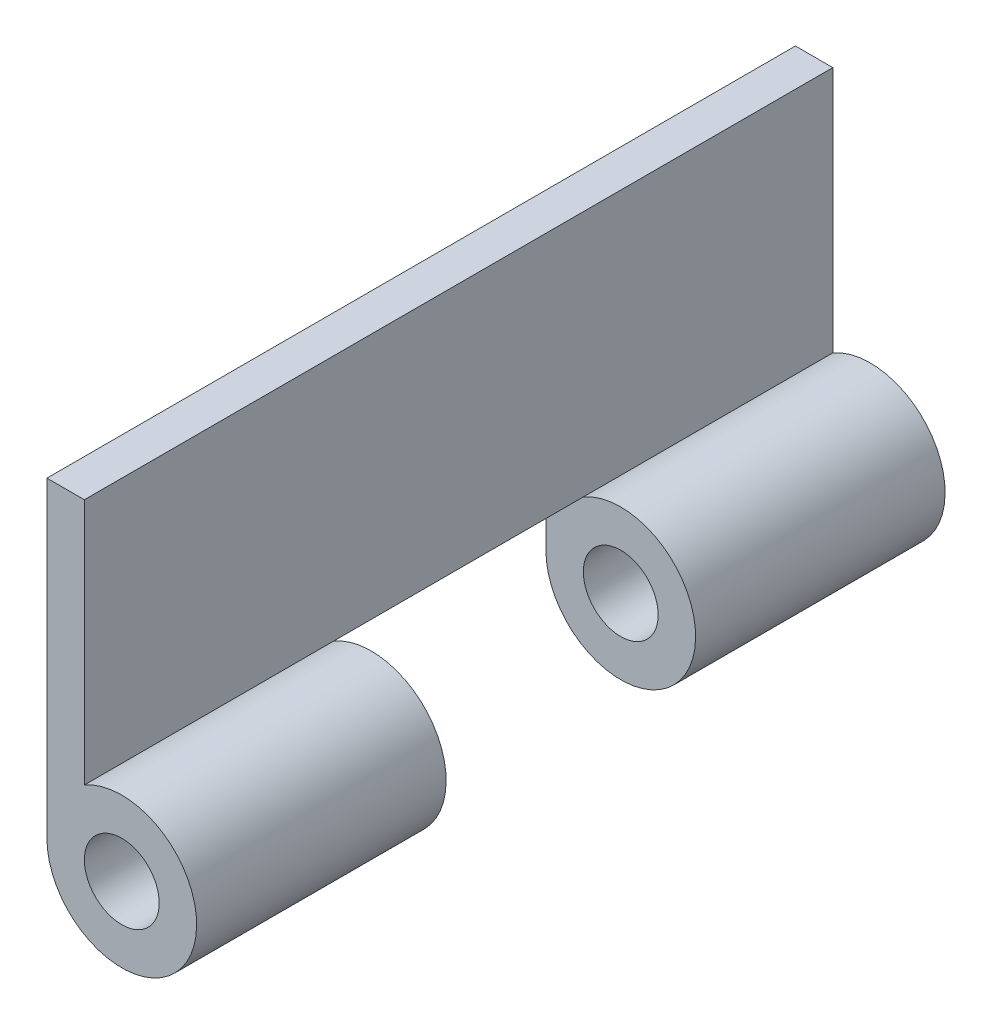
ISO-10303-21;
HEADER;
FILE_DESCRIPTION(('STEP AP214'),'2;1');
FILE_NAME('part.step','',(''),(''),'','','');
FILE_SCHEMA(('AUTOMOTIVE_DESIGN { 1 0 10303 214 1 1 1 1 }'));
ENDSEC;
DATA;
#1=APPLICATION_CONTEXT('core data for automotive mechanical design processes');
#2=APPLICATION_PROTOCOL_DEFINITION('international standard','automotive_design',2000,#1);
#3=PRODUCT_CONTEXT('',#1,'mechanical');
#4=PRODUCT('Part','Part','',(#3));
#5=PRODUCT_RELATED_PRODUCT_CATEGORY('part','',(#4));
#6=PRODUCT_DEFINITION_FORMATION('','',#4);
#7=PRODUCT_DEFINITION_CONTEXT('part definition',#1,'design');
#8=PRODUCT_DEFINITION('design','',#6,#7);
#9=PRODUCT_DEFINITION_SHAPE('','',#8);
#10=(LENGTH_UNIT() NAMED_UNIT(*) SI_UNIT(.MILLI.,.METRE.));
#11=(NAMED_UNIT(*) PLANE_ANGLE_UNIT() SI_UNIT($,.RADIAN.));
#12=(NAMED_UNIT(*) SI_UNIT($,.STERADIAN.) SOLID_ANGLE_UNIT());
#13=UNCERTAINTY_MEASURE_WITH_UNIT(LENGTH_MEASURE(1.E-05),#10,'distance_accuracy_value','');
#14=(GEOMETRIC_REPRESENTATION_CONTEXT(3) GLOBAL_UNCERTAINTY_ASSIGNED_CONTEXT((#13)) GLOBAL_UNIT_ASSIGNED_CONTEXT((#10,
#11,#12)) REPRESENTATION_CONTEXT('',''));
#15=CARTESIAN_POINT('',(0.,0.,0.));
#16=DIRECTION('',(0.,0.,1.));
#17=DIRECTION('',(1.,0.,0.));
#18=AXIS2_PLACEMENT_3D('',#15,#16,#17);
#19=CARTESIAN_POINT('',(0.,0.,60.));
#20=DIRECTION('',(0.,0.,-1.));
#21=DIRECTION('',(-1.,0.,0.));
#22=AXIS2_PLACEMENT_3D('',#19,#20,#21);
#23=CYLINDRICAL_SURFACE('',#22,6.);
#24=CARTESIAN_POINT('',(0.,0.,20.));
#25=DIRECTION('',(0.,0.,1.));
#26=DIRECTION('',(1.,0.,0.));
#27=AXIS2_PLACEMENT_3D('',#24,#25,#26);
#28=CIRCLE('',#27,6.);
#29=CARTESIAN_POINT('',(-6.,0.,20.));
#30=VERTEX_POINT('',#29);
#31=CARTESIAN_POINT('',(-3.,5.19615242270663,20.));
#32=VERTEX_POINT('',#31);
#33=EDGE_CURVE('E159',#30,#32,#28,.T.);
#34=ORIENTED_EDGE('',*,*,#33,.F.);
#35=DIRECTION('',(0.,0.,-1.));
#36=VECTOR('',#35,1.);
#37=CARTESIAN_POINT('',(-6.,0.,60.));
#38=LINE('',#37,#36);
#39=CARTESIAN_POINT('',(-6.,0.,0.));
#40=VERTEX_POINT('',#39);
#41=EDGE_CURVE('E88',#30,#40,#38,.T.);
#42=ORIENTED_EDGE('',*,*,#41,.T.);
#43=CARTESIAN_POINT('',(0.,0.,0.));
#44=DIRECTION('',(0.,0.,1.));
#45=DIRECTION('',(1.,0.,0.));
#46=AXIS2_PLACEMENT_3D('',#43,#44,#45);
#47=CIRCLE('',#46,6.);
#48=CARTESIAN_POINT('',(-3.,5.19615242270663,0.));
#49=VERTEX_POINT('',#48);
#50=EDGE_CURVE('E200',#40,#49,#47,.T.);
#51=ORIENTED_EDGE('',*,*,#50,.T.);
#52=DIRECTION('',(0.,0.,-1.));
#53=VECTOR('',#52,1.);
#54=CARTESIAN_POINT('',(-3.,5.19615242270663,60.));
#55=LINE('',#54,#53);
#56=EDGE_CURVE('E49',#32,#49,#55,.T.);
#57=ORIENTED_EDGE('',*,*,#56,.F.);
#58=EDGE_LOOP('',(#34,#42,#51,#57));
#59=FACE_BOUND('',#58,.T.);
#60=ADVANCED_FACE('F39',(#59),#23,.T.);
#61=CARTESIAN_POINT('',(0.,0.,60.));
#62=DIRECTION('',(0.,0.,-1.));
#63=DIRECTION('',(-1.,0.,0.));
#64=AXIS2_PLACEMENT_3D('',#61,#62,#63);
#65=CYLINDRICAL_SURFACE('',#64,3.);
#66=CARTESIAN_POINT('',(0.,0.,0.));
#67=DIRECTION('',(0.,0.,1.));
#68=DIRECTION('',(1.,0.,0.));
#69=AXIS2_PLACEMENT_3D('',#66,#67,#68);
#70=CIRCLE('',#69,3.);
#71=CARTESIAN_POINT('',(3.,0.,0.));
#72=VERTEX_POINT('',#71);
#73=EDGE_CURVE('E189',#72,#72,#70,.T.);
#74=ORIENTED_EDGE('',*,*,#73,.F.);
#75=EDGE_LOOP('',(#74));
#76=FACE_BOUND('',#75,.T.);
#77=CARTESIAN_POINT('',(0.,0.,20.));
#78=DIRECTION('',(0.,0.,1.));
#79=DIRECTION('',(1.,0.,0.));
#80=AXIS2_PLACEMENT_3D('',#77,#78,#79);
#81=CIRCLE('',#80,3.);
#82=CARTESIAN_POINT('',(3.,0.,20.));
#83=VERTEX_POINT('',#82);
#84=EDGE_CURVE('E125',#83,#83,#81,.T.);
#85=ORIENTED_EDGE('',*,*,#84,.T.);
#86=EDGE_LOOP('',(#85));
#87=FACE_BOUND('',#86,.T.);
#88=ADVANCED_FACE('F150',(#76,#87),#65,.F.);
#89=CARTESIAN_POINT('',(0.,0.,60.));
#90=DIRECTION('',(0.,0.,1.));
#91=DIRECTION('',(1.,0.,0.));
#92=AXIS2_PLACEMENT_3D('',#89,#90,#91);
#93=PLANE('',#92);
#94=CARTESIAN_POINT('',(0.,0.,60.));
#95=DIRECTION('',(0.,0.,1.));
#96=DIRECTION('',(1.,0.,0.));
#97=AXIS2_PLACEMENT_3D('',#94,#95,#96);
#98=CIRCLE('',#97,6.);
#99=CARTESIAN_POINT('',(-6.,0.,60.));
#100=VERTEX_POINT('',#99);
#101=CARTESIAN_POINT('',(-3.,5.19615242270663,60.));
#102=VERTEX_POINT('',#101);
#103=EDGE_CURVE('E203',#100,#102,#98,.T.);
#104=ORIENTED_EDGE('',*,*,#103,.T.);
#105=DIRECTION('',(0.,1.,0.));
#106=VECTOR('',#105,1.);
#107=CARTESIAN_POINT('',(-3.,25.,60.));
#108=LINE('',#107,#106);
#109=CARTESIAN_POINT('',(-3.,25.,60.));
#110=VERTEX_POINT('',#109);
#111=EDGE_CURVE('E95',#102,#110,#108,.T.);
#112=ORIENTED_EDGE('',*,*,#111,.T.);
#113=DIRECTION('',(-1.,0.,0.));
#114=VECTOR('',#113,1.);
#115=CARTESIAN_POINT('',(-6.,25.,60.));
#116=LINE('',#115,#114);
#117=CARTESIAN_POINT('',(-6.,25.,60.));
#118=VERTEX_POINT('',#117);
#119=EDGE_CURVE('E174',#110,#118,#116,.T.);
#120=ORIENTED_EDGE('',*,*,#119,.T.);
#121=DIRECTION('',(0.,-1.,0.));
#122=VECTOR('',#121,1.);
#123=CARTESIAN_POINT('',(-6.,0.,60.));
#124=LINE('',#123,#122);
#125=EDGE_CURVE('E66',#118,#100,#124,.T.);
#126=ORIENTED_EDGE('',*,*,#125,.T.);
#127=EDGE_LOOP('',(#104,#112,#120,#126));
#128=FACE_BOUND('',#127,.T.);
#129=CARTESIAN_POINT('',(0.,0.,60.));
#130=DIRECTION('',(0.,0.,1.));
#131=DIRECTION('',(1.,0.,0.));
#132=AXIS2_PLACEMENT_3D('',#129,#130,#131);
#133=CIRCLE('',#132,3.);
#134=CARTESIAN_POINT('',(3.,0.,60.));
#135=VERTEX_POINT('',#134);
#136=EDGE_CURVE('E194',#135,#135,#133,.T.);
#137=ORIENTED_EDGE('',*,*,#136,.F.);
#138=EDGE_LOOP('',(#137));
#139=FACE_BOUND('',#138,.T.);
#140=ADVANCED_FACE('F154',(#128,#139),#93,.T.);
#141=CARTESIAN_POINT('',(0.,0.,0.));
#142=DIRECTION('',(0.,0.,1.));
#143=DIRECTION('',(1.,0.,0.));
#144=AXIS2_PLACEMENT_3D('',#141,#142,#143);
#145=PLANE('',#144);
#146=ORIENTED_EDGE('',*,*,#50,.F.);
#147=DIRECTION('',(0.,-1.,0.));
#148=VECTOR('',#147,1.);
#149=CARTESIAN_POINT('',(-6.,0.,0.));
#150=LINE('',#149,#148);
#151=CARTESIAN_POINT('',(-6.,25.,0.));
#152=VERTEX_POINT('',#151);
#153=EDGE_CURVE('E167',#152,#40,#150,.T.);
#154=ORIENTED_EDGE('',*,*,#153,.F.);
#155=DIRECTION('',(-1.,0.,0.));
#156=VECTOR('',#155,1.);
#157=CARTESIAN_POINT('',(-6.,25.,0.));
#158=LINE('',#157,#156);
#159=CARTESIAN_POINT('',(-3.,25.,0.));
#160=VERTEX_POINT('',#159);
#161=EDGE_CURVE('E213',#160,#152,#158,.T.);
#162=ORIENTED_EDGE('',*,*,#161,.F.);
#163=DIRECTION('',(0.,1.,0.));
#164=VECTOR('',#163,1.);
#165=CARTESIAN_POINT('',(-3.,25.,0.));
#166=LINE('',#165,#164);
#167=EDGE_CURVE('E137',#49,#160,#166,.T.);
#168=ORIENTED_EDGE('',*,*,#167,.F.);
#169=EDGE_LOOP('',(#146,#154,#162,#168));
#170=FACE_BOUND('',#169,.T.);
#171=ORIENTED_EDGE('',*,*,#73,.T.);
#172=EDGE_LOOP('',(#171));
#173=FACE_BOUND('',#172,.T.);
#174=ADVANCED_FACE('F148',(#170,#173),#145,.F.);
#175=CARTESIAN_POINT('',(-6.,0.,40.));
#176=VERTEX_POINT('',#175);
#177=EDGE_CURVE('E131',#100,#176,#38,.T.);
#178=ORIENTED_EDGE('',*,*,#177,.T.);
#179=CARTESIAN_POINT('',(0.,0.,40.));
#180=DIRECTION('',(0.,0.,1.));
#181=DIRECTION('',(1.,0.,0.));
#182=AXIS2_PLACEMENT_3D('',#179,#180,#181);
#183=CIRCLE('',#182,6.);
#184=CARTESIAN_POINT('',(-3.,5.19615242270663,40.));
#185=VERTEX_POINT('',#184);
#186=EDGE_CURVE('E114',#176,#185,#183,.T.);
#187=ORIENTED_EDGE('',*,*,#186,.T.);
#188=EDGE_CURVE('E11',#102,#185,#55,.T.);
#189=ORIENTED_EDGE('',*,*,#188,.F.);
#190=ORIENTED_EDGE('',*,*,#103,.F.);
#191=EDGE_LOOP('',(#178,#187,#189,#190));
#192=FACE_BOUND('',#191,.T.);
#193=ADVANCED_FACE('F41',(#192),#23,.T.);
#194=CARTESIAN_POINT('',(-3.,25.,60.));
#195=DIRECTION('',(-1.,0.,0.));
#196=DIRECTION('',(0.,-1.,0.));
#197=AXIS2_PLACEMENT_3D('',#194,#195,#196);
#198=PLANE('',#197);
#199=ORIENTED_EDGE('',*,*,#167,.T.);
#200=DIRECTION('',(0.,0.,-1.));
#201=VECTOR('',#200,1.);
#202=CARTESIAN_POINT('',(-3.,25.,60.));
#203=LINE('',#202,#201);
#204=EDGE_CURVE('E181',#110,#160,#203,.T.);
#205=ORIENTED_EDGE('',*,*,#204,.F.);
#206=ORIENTED_EDGE('',*,*,#111,.F.);
#207=ORIENTED_EDGE('',*,*,#188,.T.);
#208=DIRECTION('',(0.,0.,-1.));
#209=VECTOR('',#208,1.);
#210=CARTESIAN_POINT('',(-3.,5.19615242270663,40.));
#211=LINE('',#210,#209);
#212=EDGE_CURVE('E120',#185,#32,#211,.T.);
#213=ORIENTED_EDGE('',*,*,#212,.T.);
#214=ORIENTED_EDGE('',*,*,#56,.T.);
#215=EDGE_LOOP('',(#199,#205,#206,#207,#213,#214));
#216=FACE_BOUND('',#215,.T.);
#217=ADVANCED_FACE('F135',(#216),#198,.F.);
#218=CARTESIAN_POINT('',(-6.,25.,60.));
#219=DIRECTION('',(0.,-1.,0.));
#220=DIRECTION('',(0.,0.,-1.));
#221=AXIS2_PLACEMENT_3D('',#218,#219,#220);
#222=PLANE('',#221);
#223=ORIENTED_EDGE('',*,*,#161,.T.);
#224=DIRECTION('',(0.,0.,-1.));
#225=VECTOR('',#224,1.);
#226=CARTESIAN_POINT('',(-6.,25.,60.));
#227=LINE('',#226,#225);
#228=EDGE_CURVE('E173',#118,#152,#227,.T.);
#229=ORIENTED_EDGE('',*,*,#228,.F.);
#230=ORIENTED_EDGE('',*,*,#119,.F.);
#231=ORIENTED_EDGE('',*,*,#204,.T.);
#232=EDGE_LOOP('',(#223,#229,#230,#231));
#233=FACE_BOUND('',#232,.T.);
#234=ADVANCED_FACE('F140',(#233),#222,.F.);
#235=CARTESIAN_POINT('',(-6.,0.,60.));
#236=DIRECTION('',(1.,0.,0.));
#237=DIRECTION('',(0.,1.,0.));
#238=AXIS2_PLACEMENT_3D('',#235,#236,#237);
#239=PLANE('',#238);
#240=DIRECTION('',(0.,0.,-1.));
#241=VECTOR('',#240,1.);
#242=CARTESIAN_POINT('',(-6.,5.19615242270664,40.));
#243=LINE('',#242,#241);
#244=CARTESIAN_POINT('',(-6.,5.19615242270664,40.));
#245=VERTEX_POINT('',#244);
#246=CARTESIAN_POINT('',(-6.,5.19615242270664,20.));
#247=VERTEX_POINT('',#246);
#248=EDGE_CURVE('E57',#245,#247,#243,.T.);
#249=ORIENTED_EDGE('',*,*,#248,.F.);
#250=DIRECTION('',(0.,-1.,0.));
#251=VECTOR('',#250,1.);
#252=CARTESIAN_POINT('',(-6.,5.19615242270664,40.));
#253=LINE('',#252,#251);
#254=EDGE_CURVE('E116',#245,#176,#253,.T.);
#255=ORIENTED_EDGE('',*,*,#254,.T.);
#256=ORIENTED_EDGE('',*,*,#177,.F.);
#257=ORIENTED_EDGE('',*,*,#125,.F.);
#258=ORIENTED_EDGE('',*,*,#228,.T.);
#259=ORIENTED_EDGE('',*,*,#153,.T.);
#260=ORIENTED_EDGE('',*,*,#41,.F.);
#261=DIRECTION('',(0.,-1.,0.));
#262=VECTOR('',#261,1.);
#263=CARTESIAN_POINT('',(-6.,5.19615242270664,20.));
#264=LINE('',#263,#262);
#265=EDGE_CURVE('E133',#247,#30,#264,.T.);
#266=ORIENTED_EDGE('',*,*,#265,.F.);
#267=EDGE_LOOP('',(#249,#255,#256,#257,#258,#259,#260,#266));
#268=FACE_BOUND('',#267,.T.);
#269=ADVANCED_FACE('F145',(#268),#239,.F.);
#270=CARTESIAN_POINT('',(0.,0.,40.));
#271=DIRECTION('',(0.,0.,1.));
#272=DIRECTION('',(1.,0.,0.));
#273=AXIS2_PLACEMENT_3D('',#270,#271,#272);
#274=CIRCLE('',#273,3.);
#275=CARTESIAN_POINT('',(3.,0.,40.));
#276=VERTEX_POINT('',#275);
#277=EDGE_CURVE('E43',#276,#276,#274,.T.);
#278=ORIENTED_EDGE('',*,*,#277,.F.);
#279=EDGE_LOOP('',(#278));
#280=FACE_BOUND('',#279,.T.);
#281=ORIENTED_EDGE('',*,*,#136,.T.);
#282=EDGE_LOOP('',(#281));
#283=FACE_BOUND('',#282,.T.);
#284=ADVANCED_FACE('F157',(#280,#283),#65,.F.);
#285=CARTESIAN_POINT('',(-3.,5.19615242270663,40.));
#286=DIRECTION('',(0.,-1.,0.));
#287=DIRECTION('',(1.,0.,0.));
#288=AXIS2_PLACEMENT_3D('',#285,#286,#287);
#289=PLANE('',#288);
#290=DIRECTION('',(-1.,0.,0.));
#291=VECTOR('',#290,1.);
#292=CARTESIAN_POINT('',(-3.,5.19615242270663,20.));
#293=LINE('',#292,#291);
#294=EDGE_CURVE('E122',#32,#247,#293,.T.);
#295=ORIENTED_EDGE('',*,*,#294,.F.);
#296=ORIENTED_EDGE('',*,*,#212,.F.);
#297=DIRECTION('',(-1.,0.,0.));
#298=VECTOR('',#297,1.);
#299=CARTESIAN_POINT('',(-3.,5.19615242270663,40.));
#300=LINE('',#299,#298);
#301=EDGE_CURVE('E110',#185,#245,#300,.T.);
#302=ORIENTED_EDGE('',*,*,#301,.T.);
#303=ORIENTED_EDGE('',*,*,#248,.T.);
#304=EDGE_LOOP('',(#295,#296,#302,#303));
#305=FACE_BOUND('',#304,.T.);
#306=ADVANCED_FACE('F121',(#305),#289,.T.);
#307=CARTESIAN_POINT('',(0.,0.,40.));
#308=DIRECTION('',(0.,0.,1.));
#309=DIRECTION('',(1.,0.,0.));
#310=AXIS2_PLACEMENT_3D('',#307,#308,#309);
#311=PLANE('',#310);
#312=ORIENTED_EDGE('',*,*,#277,.T.);
#313=EDGE_LOOP('',(#312));
#314=FACE_BOUND('',#313,.T.);
#315=ORIENTED_EDGE('',*,*,#186,.F.);
#316=ORIENTED_EDGE('',*,*,#254,.F.);
#317=ORIENTED_EDGE('',*,*,#301,.F.);
#318=EDGE_LOOP('',(#315,#316,#317));
#319=FACE_BOUND('',#318,.T.);
#320=ADVANCED_FACE('F112',(#314,#319),#311,.F.);
#321=CARTESIAN_POINT('',(0.,0.,20.));
#322=DIRECTION('',(0.,0.,1.));
#323=DIRECTION('',(1.,0.,0.));
#324=AXIS2_PLACEMENT_3D('',#321,#322,#323);
#325=PLANE('',#324);
#326=ORIENTED_EDGE('',*,*,#84,.F.);
#327=EDGE_LOOP('',(#326));
#328=FACE_BOUND('',#327,.T.);
#329=ORIENTED_EDGE('',*,*,#33,.T.);
#330=ORIENTED_EDGE('',*,*,#294,.T.);
#331=ORIENTED_EDGE('',*,*,#265,.T.);
#332=EDGE_LOOP('',(#329,#330,#331));
#333=FACE_BOUND('',#332,.T.);
#334=ADVANCED_FACE('F238',(#328,#333),#325,.T.);
#335=CLOSED_SHELL('',(#60,#88,#140,#174,#193,#217,#234,#269,#284,#306,#320,#334));
#336=MANIFOLD_SOLID_BREP('B2',#335);
#337=ADVANCED_BREP_SHAPE_REPRESENTATION('',(#18,#336),#14);
#338=SHAPE_DEFINITION_REPRESENTATION(#9,#337);
ENDSEC;
END-ISO-10303-21;
